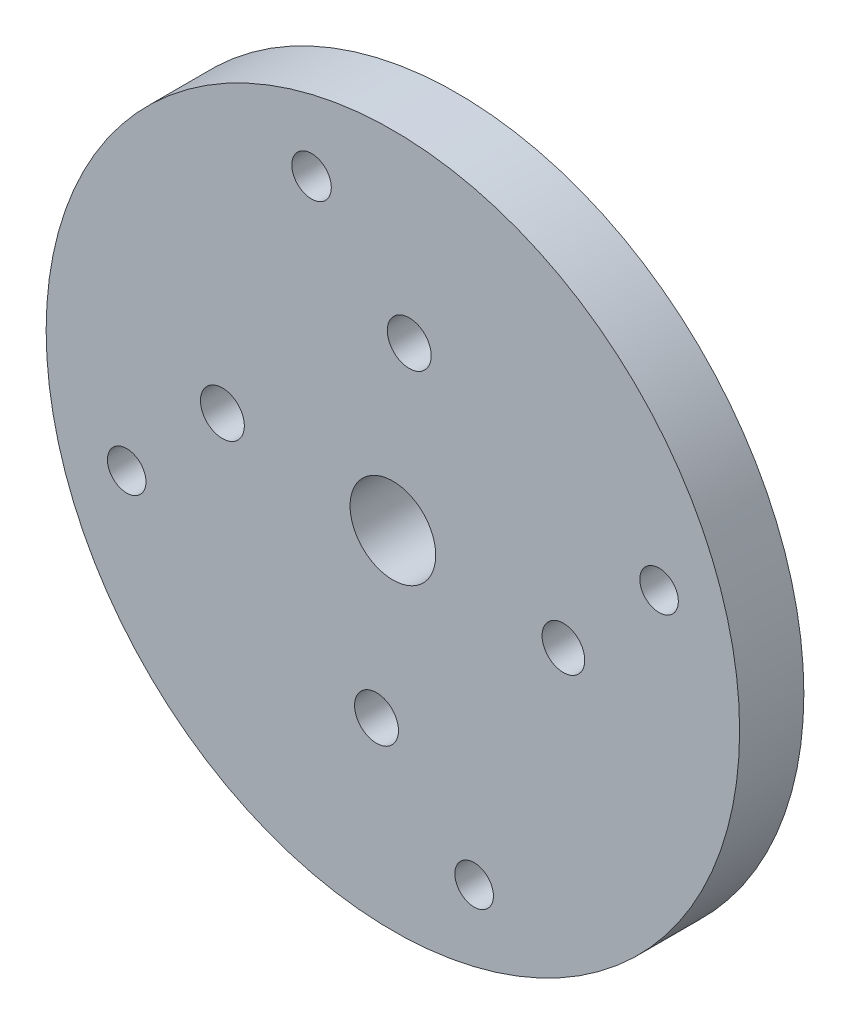
ISO-10303-21;
HEADER;
FILE_DESCRIPTION(('STEP AP214'),'2;1');
FILE_NAME('part.step','',(''),(''),'','','');
FILE_SCHEMA(('AUTOMOTIVE_DESIGN { 1 0 10303 214 1 1 1 1 }'));
ENDSEC;
DATA;
#1=APPLICATION_CONTEXT('core data for automotive mechanical design processes');
#2=APPLICATION_PROTOCOL_DEFINITION('international standard','automotive_design',2000,#1);
#3=PRODUCT_CONTEXT('',#1,'mechanical');
#4=PRODUCT('Part','Part','',(#3));
#5=PRODUCT_RELATED_PRODUCT_CATEGORY('part','',(#4));
#6=PRODUCT_DEFINITION_FORMATION('','',#4);
#7=PRODUCT_DEFINITION_CONTEXT('part definition',#1,'design');
#8=PRODUCT_DEFINITION('design','',#6,#7);
#9=PRODUCT_DEFINITION_SHAPE('','',#8);
#10=(LENGTH_UNIT() NAMED_UNIT(*) SI_UNIT(.MILLI.,.METRE.));
#11=(NAMED_UNIT(*) PLANE_ANGLE_UNIT() SI_UNIT($,.RADIAN.));
#12=(NAMED_UNIT(*) SI_UNIT($,.STERADIAN.) SOLID_ANGLE_UNIT());
#13=UNCERTAINTY_MEASURE_WITH_UNIT(LENGTH_MEASURE(1.E-05),#10,'distance_accuracy_value','');
#14=(GEOMETRIC_REPRESENTATION_CONTEXT(3) GLOBAL_UNCERTAINTY_ASSIGNED_CONTEXT((#13)) GLOBAL_UNIT_ASSIGNED_CONTEXT((#10,
#11,#12)) REPRESENTATION_CONTEXT('',''));
#15=CARTESIAN_POINT('',(0.,0.,0.));
#16=DIRECTION('',(0.,0.,1.));
#17=DIRECTION('',(1.,0.,0.));
#18=AXIS2_PLACEMENT_3D('',#15,#16,#17);
#19=CARTESIAN_POINT('',(0.,0.,3.));
#20=DIRECTION('',(0.,0.,1.));
#21=DIRECTION('',(1.,0.,0.));
#22=AXIS2_PLACEMENT_3D('',#19,#20,#21);
#23=PLANE('',#22);
#24=CARTESIAN_POINT('',(-12.432397674173,-3.79940627877776,3.));
#25=DIRECTION('',(0.,0.,1.));
#26=DIRECTION('',(1.,0.,0.));
#27=AXIS2_PLACEMENT_3D('',#24,#25,#26);
#28=CIRCLE('',#27,0.899999999999998);
#29=CARTESIAN_POINT('',(-11.532397674173,-3.79940627877776,3.));
#30=VERTEX_POINT('',#29);
#31=EDGE_CURVE('E92',#30,#30,#28,.T.);
#32=ORIENTED_EDGE('',*,*,#31,.F.);
#33=EDGE_LOOP('',(#32));
#34=FACE_BOUND('',#33,.T.);
#35=CARTESIAN_POINT('',(3.7952286765895,-12.4336736040638,3.));
#36=DIRECTION('',(0.,0.,1.));
#37=DIRECTION('',(1.,0.,0.));
#38=AXIS2_PLACEMENT_3D('',#35,#36,#37);
#39=CIRCLE('',#38,0.899999999999999);
#40=CARTESIAN_POINT('',(4.6952286765895,-12.4336736040638,3.));
#41=VERTEX_POINT('',#40);
#42=EDGE_CURVE('E86',#41,#41,#39,.T.);
#43=ORIENTED_EDGE('',*,*,#42,.F.);
#44=EDGE_LOOP('',(#43));
#45=FACE_BOUND('',#44,.T.);
#46=CARTESIAN_POINT('',(12.4323976741731,3.79940627877781,3.));
#47=DIRECTION('',(0.,0.,1.));
#48=DIRECTION('',(1.,0.,0.));
#49=AXIS2_PLACEMENT_3D('',#46,#47,#48);
#50=CIRCLE('',#49,0.9);
#51=CARTESIAN_POINT('',(13.3323976741731,3.79940627877781,3.));
#52=VERTEX_POINT('',#51);
#53=EDGE_CURVE('E80',#52,#52,#50,.T.);
#54=ORIENTED_EDGE('',*,*,#53,.F.);
#55=EDGE_LOOP('',(#54));
#56=FACE_BOUND('',#55,.T.);
#57=CARTESIAN_POINT('',(-3.79940627877772,12.4323976741731,3.));
#58=DIRECTION('',(0.,0.,1.));
#59=DIRECTION('',(1.,0.,0.));
#60=AXIS2_PLACEMENT_3D('',#57,#58,#59);
#61=CIRCLE('',#60,0.922873217244393);
#62=CARTESIAN_POINT('',(-2.87653306153333,12.4323976741731,3.));
#63=VERTEX_POINT('',#62);
#64=EDGE_CURVE('E74',#63,#63,#61,.T.);
#65=ORIENTED_EDGE('',*,*,#64,.F.);
#66=EDGE_LOOP('',(#65));
#67=FACE_BOUND('',#66,.T.);
#68=CARTESIAN_POINT('',(-0.764662688049769,-7.963371834437,3.));
#69=DIRECTION('',(0.,0.,1.));
#70=DIRECTION('',(1.,0.,0.));
#71=AXIS2_PLACEMENT_3D('',#68,#69,#70);
#72=CIRCLE('',#71,1.0250000000001);
#73=CARTESIAN_POINT('',(0.260337311950333,-7.963371834437,3.));
#74=VERTEX_POINT('',#73);
#75=EDGE_CURVE('E68',#74,#74,#72,.T.);
#76=ORIENTED_EDGE('',*,*,#75,.F.);
#77=EDGE_LOOP('',(#76));
#78=FACE_BOUND('',#77,.T.);
#79=CARTESIAN_POINT('',(-7.96337183443698,0.764662688049787,3.));
#80=DIRECTION('',(0.,0.,1.));
#81=DIRECTION('',(1.,0.,0.));
#82=AXIS2_PLACEMENT_3D('',#79,#80,#81);
#83=CIRCLE('',#82,1.0250000000001);
#84=CARTESIAN_POINT('',(-6.93837183443688,0.764662688049787,3.));
#85=VERTEX_POINT('',#84);
#86=EDGE_CURVE('E62',#85,#85,#83,.T.);
#87=ORIENTED_EDGE('',*,*,#86,.F.);
#88=EDGE_LOOP('',(#87));
#89=FACE_BOUND('',#88,.T.);
#90=CARTESIAN_POINT('',(0.764662688049797,7.963371834437,3.));
#91=DIRECTION('',(0.,0.,1.));
#92=DIRECTION('',(1.,0.,0.));
#93=AXIS2_PLACEMENT_3D('',#90,#91,#92);
#94=CIRCLE('',#93,1.0250000000001);
#95=CARTESIAN_POINT('',(1.7896626880499,7.963371834437,3.));
#96=VERTEX_POINT('',#95);
#97=EDGE_CURVE('E56',#96,#96,#94,.T.);
#98=ORIENTED_EDGE('',*,*,#97,.F.);
#99=EDGE_LOOP('',(#98));
#100=FACE_BOUND('',#99,.T.);
#101=CARTESIAN_POINT('',(7.96337183443701,-0.76466268804978,3.));
#102=DIRECTION('',(0.,0.,1.));
#103=DIRECTION('',(1.,0.,0.));
#104=AXIS2_PLACEMENT_3D('',#101,#102,#103);
#105=CIRCLE('',#104,0.997616065397464);
#106=CARTESIAN_POINT('',(8.96098789983448,-0.76466268804978,3.));
#107=VERTEX_POINT('',#106);
#108=EDGE_CURVE('E50',#107,#107,#105,.T.);
#109=ORIENTED_EDGE('',*,*,#108,.F.);
#110=EDGE_LOOP('',(#109));
#111=FACE_BOUND('',#110,.T.);
#112=CARTESIAN_POINT('',(0.,0.,3.));
#113=DIRECTION('',(0.,0.,1.));
#114=DIRECTION('',(1.,0.,0.));
#115=AXIS2_PLACEMENT_3D('',#112,#113,#114);
#116=CIRCLE('',#115,16.1955905314912);
#117=CARTESIAN_POINT('',(16.1955905314912,0.,3.));
#118=VERTEX_POINT('',#117);
#119=EDGE_CURVE('E10',#118,#118,#116,.T.);
#120=ORIENTED_EDGE('',*,*,#119,.T.);
#121=EDGE_LOOP('',(#120));
#122=FACE_BOUND('',#121,.T.);
#123=CARTESIAN_POINT('',(0.,0.,3.));
#124=DIRECTION('',(0.,0.,1.));
#125=DIRECTION('',(1.,0.,0.));
#126=AXIS2_PLACEMENT_3D('',#123,#124,#125);
#127=CIRCLE('',#126,2.);
#128=CARTESIAN_POINT('',(2.,0.,3.));
#129=VERTEX_POINT('',#128);
#130=EDGE_CURVE('E42',#129,#129,#127,.T.);
#131=ORIENTED_EDGE('',*,*,#130,.F.);
#132=EDGE_LOOP('',(#131));
#133=FACE_BOUND('',#132,.T.);
#134=ADVANCED_FACE('F31',(#34,#45,#56,#67,#78,#89,#100,#111,#122,#133),#23,.T.);
#135=CARTESIAN_POINT('',(0.,0.,0.));
#136=DIRECTION('',(0.,0.,1.));
#137=DIRECTION('',(1.,0.,0.));
#138=AXIS2_PLACEMENT_3D('',#135,#136,#137);
#139=PLANE('',#138);
#140=CARTESIAN_POINT('',(-12.432397674173,-3.79940627877776,0.));
#141=DIRECTION('',(0.,0.,1.));
#142=DIRECTION('',(1.,0.,0.));
#143=AXIS2_PLACEMENT_3D('',#140,#141,#142);
#144=CIRCLE('',#143,0.899999999999998);
#145=CARTESIAN_POINT('',(-11.532397674173,-3.79940627877776,0.));
#146=VERTEX_POINT('',#145);
#147=EDGE_CURVE('E89',#146,#146,#144,.T.);
#148=ORIENTED_EDGE('',*,*,#147,.T.);
#149=EDGE_LOOP('',(#148));
#150=FACE_BOUND('',#149,.T.);
#151=CARTESIAN_POINT('',(3.7952286765895,-12.4336736040638,0.));
#152=DIRECTION('',(0.,0.,1.));
#153=DIRECTION('',(1.,0.,0.));
#154=AXIS2_PLACEMENT_3D('',#151,#152,#153);
#155=CIRCLE('',#154,0.899999999999999);
#156=CARTESIAN_POINT('',(4.6952286765895,-12.4336736040638,0.));
#157=VERTEX_POINT('',#156);
#158=EDGE_CURVE('E83',#157,#157,#155,.T.);
#159=ORIENTED_EDGE('',*,*,#158,.T.);
#160=EDGE_LOOP('',(#159));
#161=FACE_BOUND('',#160,.T.);
#162=CARTESIAN_POINT('',(12.4323976741731,3.79940627877781,0.));
#163=DIRECTION('',(0.,0.,1.));
#164=DIRECTION('',(1.,0.,0.));
#165=AXIS2_PLACEMENT_3D('',#162,#163,#164);
#166=CIRCLE('',#165,0.9);
#167=CARTESIAN_POINT('',(13.3323976741731,3.79940627877781,0.));
#168=VERTEX_POINT('',#167);
#169=EDGE_CURVE('E77',#168,#168,#166,.T.);
#170=ORIENTED_EDGE('',*,*,#169,.T.);
#171=EDGE_LOOP('',(#170));
#172=FACE_BOUND('',#171,.T.);
#173=CARTESIAN_POINT('',(-3.79940627877772,12.4323976741731,0.));
#174=DIRECTION('',(0.,0.,1.));
#175=DIRECTION('',(1.,0.,0.));
#176=AXIS2_PLACEMENT_3D('',#173,#174,#175);
#177=CIRCLE('',#176,0.922873217244393);
#178=CARTESIAN_POINT('',(-2.87653306153333,12.4323976741731,0.));
#179=VERTEX_POINT('',#178);
#180=EDGE_CURVE('E71',#179,#179,#177,.T.);
#181=ORIENTED_EDGE('',*,*,#180,.T.);
#182=EDGE_LOOP('',(#181));
#183=FACE_BOUND('',#182,.T.);
#184=CARTESIAN_POINT('',(-0.764662688049769,-7.963371834437,0.));
#185=DIRECTION('',(0.,0.,1.));
#186=DIRECTION('',(1.,0.,0.));
#187=AXIS2_PLACEMENT_3D('',#184,#185,#186);
#188=CIRCLE('',#187,1.0250000000001);
#189=CARTESIAN_POINT('',(0.260337311950333,-7.963371834437,0.));
#190=VERTEX_POINT('',#189);
#191=EDGE_CURVE('E65',#190,#190,#188,.T.);
#192=ORIENTED_EDGE('',*,*,#191,.T.);
#193=EDGE_LOOP('',(#192));
#194=FACE_BOUND('',#193,.T.);
#195=CARTESIAN_POINT('',(-7.96337183443698,0.764662688049787,0.));
#196=DIRECTION('',(0.,0.,1.));
#197=DIRECTION('',(1.,0.,0.));
#198=AXIS2_PLACEMENT_3D('',#195,#196,#197);
#199=CIRCLE('',#198,1.0250000000001);
#200=CARTESIAN_POINT('',(-6.93837183443688,0.764662688049787,0.));
#201=VERTEX_POINT('',#200);
#202=EDGE_CURVE('E59',#201,#201,#199,.T.);
#203=ORIENTED_EDGE('',*,*,#202,.T.);
#204=EDGE_LOOP('',(#203));
#205=FACE_BOUND('',#204,.T.);
#206=CARTESIAN_POINT('',(0.764662688049797,7.963371834437,0.));
#207=DIRECTION('',(0.,0.,1.));
#208=DIRECTION('',(1.,0.,0.));
#209=AXIS2_PLACEMENT_3D('',#206,#207,#208);
#210=CIRCLE('',#209,1.0250000000001);
#211=CARTESIAN_POINT('',(1.7896626880499,7.963371834437,0.));
#212=VERTEX_POINT('',#211);
#213=EDGE_CURVE('E53',#212,#212,#210,.T.);
#214=ORIENTED_EDGE('',*,*,#213,.T.);
#215=EDGE_LOOP('',(#214));
#216=FACE_BOUND('',#215,.T.);
#217=CARTESIAN_POINT('',(7.96337183443701,-0.76466268804978,0.));
#218=DIRECTION('',(0.,0.,1.));
#219=DIRECTION('',(1.,0.,0.));
#220=AXIS2_PLACEMENT_3D('',#217,#218,#219);
#221=CIRCLE('',#220,0.997616065397464);
#222=CARTESIAN_POINT('',(8.96098789983448,-0.76466268804978,0.));
#223=VERTEX_POINT('',#222);
#224=EDGE_CURVE('E47',#223,#223,#221,.T.);
#225=ORIENTED_EDGE('',*,*,#224,.T.);
#226=EDGE_LOOP('',(#225));
#227=FACE_BOUND('',#226,.T.);
#228=CARTESIAN_POINT('',(0.,0.,0.));
#229=DIRECTION('',(0.,0.,1.));
#230=DIRECTION('',(1.,0.,0.));
#231=AXIS2_PLACEMENT_3D('',#228,#229,#230);
#232=CIRCLE('',#231,16.1955905314912);
#233=CARTESIAN_POINT('',(16.1955905314912,0.,0.));
#234=VERTEX_POINT('',#233);
#235=EDGE_CURVE('E35',#234,#234,#232,.T.);
#236=ORIENTED_EDGE('',*,*,#235,.F.);
#237=EDGE_LOOP('',(#236));
#238=FACE_BOUND('',#237,.T.);
#239=CARTESIAN_POINT('',(0.,0.,0.));
#240=DIRECTION('',(0.,0.,1.));
#241=DIRECTION('',(1.,0.,0.));
#242=AXIS2_PLACEMENT_3D('',#239,#240,#241);
#243=CIRCLE('',#242,2.);
#244=CARTESIAN_POINT('',(2.,0.,0.));
#245=VERTEX_POINT('',#244);
#246=EDGE_CURVE('E44',#245,#245,#243,.T.);
#247=ORIENTED_EDGE('',*,*,#246,.T.);
#248=EDGE_LOOP('',(#247));
#249=FACE_BOUND('',#248,.T.);
#250=ADVANCED_FACE('F98',(#150,#161,#172,#183,#194,#205,#216,#227,#238,#249),#139,.F.);
#251=CARTESIAN_POINT('',(0.,0.,3.));
#252=DIRECTION('',(0.,0.,-1.));
#253=DIRECTION('',(-1.,0.,0.));
#254=AXIS2_PLACEMENT_3D('',#251,#252,#253);
#255=CYLINDRICAL_SURFACE('',#254,16.1955905314912);
#256=ORIENTED_EDGE('',*,*,#119,.F.);
#257=EDGE_LOOP('',(#256));
#258=FACE_BOUND('',#257,.T.);
#259=ORIENTED_EDGE('',*,*,#235,.T.);
#260=EDGE_LOOP('',(#259));
#261=FACE_BOUND('',#260,.T.);
#262=ADVANCED_FACE('F33',(#258,#261),#255,.T.);
#263=CARTESIAN_POINT('',(0.,0.,3.));
#264=DIRECTION('',(0.,0.,-1.));
#265=DIRECTION('',(-1.,0.,0.));
#266=AXIS2_PLACEMENT_3D('',#263,#264,#265);
#267=CYLINDRICAL_SURFACE('',#266,2.);
#268=ORIENTED_EDGE('',*,*,#130,.T.);
#269=EDGE_LOOP('',(#268));
#270=FACE_BOUND('',#269,.T.);
#271=ORIENTED_EDGE('',*,*,#246,.F.);
#272=EDGE_LOOP('',(#271));
#273=FACE_BOUND('',#272,.T.);
#274=ADVANCED_FACE('F127',(#270,#273),#267,.F.);
#275=CARTESIAN_POINT('',(7.96337183443701,-0.76466268804978,0.));
#276=DIRECTION('',(0.,0.,1.));
#277=DIRECTION('',(1.,0.,0.));
#278=AXIS2_PLACEMENT_3D('',#275,#276,#277);
#279=CYLINDRICAL_SURFACE('',#278,0.997616065397464);
#280=ORIENTED_EDGE('',*,*,#224,.F.);
#281=EDGE_LOOP('',(#280));
#282=FACE_BOUND('',#281,.T.);
#283=ORIENTED_EDGE('',*,*,#108,.T.);
#284=EDGE_LOOP('',(#283));
#285=FACE_BOUND('',#284,.T.);
#286=ADVANCED_FACE('F130',(#282,#285),#279,.F.);
#287=CARTESIAN_POINT('',(0.764662688049797,7.963371834437,0.));
#288=DIRECTION('',(0.,0.,1.));
#289=DIRECTION('',(1.,0.,0.));
#290=AXIS2_PLACEMENT_3D('',#287,#288,#289);
#291=CYLINDRICAL_SURFACE('',#290,1.0250000000001);
#292=ORIENTED_EDGE('',*,*,#213,.F.);
#293=EDGE_LOOP('',(#292));
#294=FACE_BOUND('',#293,.T.);
#295=ORIENTED_EDGE('',*,*,#97,.T.);
#296=EDGE_LOOP('',(#295));
#297=FACE_BOUND('',#296,.T.);
#298=ADVANCED_FACE('F142',(#294,#297),#291,.F.);
#299=CARTESIAN_POINT('',(-7.96337183443698,0.764662688049787,0.));
#300=DIRECTION('',(0.,0.,1.));
#301=DIRECTION('',(1.,0.,0.));
#302=AXIS2_PLACEMENT_3D('',#299,#300,#301);
#303=CYLINDRICAL_SURFACE('',#302,1.0250000000001);
#304=ORIENTED_EDGE('',*,*,#202,.F.);
#305=EDGE_LOOP('',(#304));
#306=FACE_BOUND('',#305,.T.);
#307=ORIENTED_EDGE('',*,*,#86,.T.);
#308=EDGE_LOOP('',(#307));
#309=FACE_BOUND('',#308,.T.);
#310=ADVANCED_FACE('F146',(#306,#309),#303,.F.);
#311=CARTESIAN_POINT('',(-0.764662688049769,-7.963371834437,0.));
#312=DIRECTION('',(0.,0.,1.));
#313=DIRECTION('',(1.,0.,0.));
#314=AXIS2_PLACEMENT_3D('',#311,#312,#313);
#315=CYLINDRICAL_SURFACE('',#314,1.0250000000001);
#316=ORIENTED_EDGE('',*,*,#191,.F.);
#317=EDGE_LOOP('',(#316));
#318=FACE_BOUND('',#317,.T.);
#319=ORIENTED_EDGE('',*,*,#75,.T.);
#320=EDGE_LOOP('',(#319));
#321=FACE_BOUND('',#320,.T.);
#322=ADVANCED_FACE('F150',(#318,#321),#315,.F.);
#323=CARTESIAN_POINT('',(-3.79940627877772,12.4323976741731,0.));
#324=DIRECTION('',(0.,0.,1.));
#325=DIRECTION('',(1.,0.,0.));
#326=AXIS2_PLACEMENT_3D('',#323,#324,#325);
#327=CYLINDRICAL_SURFACE('',#326,0.922873217244393);
#328=ORIENTED_EDGE('',*,*,#180,.F.);
#329=EDGE_LOOP('',(#328));
#330=FACE_BOUND('',#329,.T.);
#331=ORIENTED_EDGE('',*,*,#64,.T.);
#332=EDGE_LOOP('',(#331));
#333=FACE_BOUND('',#332,.T.);
#334=ADVANCED_FACE('F154',(#330,#333),#327,.F.);
#335=CARTESIAN_POINT('',(12.4323976741731,3.79940627877781,0.));
#336=DIRECTION('',(0.,0.,1.));
#337=DIRECTION('',(1.,0.,0.));
#338=AXIS2_PLACEMENT_3D('',#335,#336,#337);
#339=CYLINDRICAL_SURFACE('',#338,0.9);
#340=ORIENTED_EDGE('',*,*,#169,.F.);
#341=EDGE_LOOP('',(#340));
#342=FACE_BOUND('',#341,.T.);
#343=ORIENTED_EDGE('',*,*,#53,.T.);
#344=EDGE_LOOP('',(#343));
#345=FACE_BOUND('',#344,.T.);
#346=ADVANCED_FACE('F158',(#342,#345),#339,.F.);
#347=CARTESIAN_POINT('',(3.7952286765895,-12.4336736040638,0.));
#348=DIRECTION('',(0.,0.,1.));
#349=DIRECTION('',(1.,0.,0.));
#350=AXIS2_PLACEMENT_3D('',#347,#348,#349);
#351=CYLINDRICAL_SURFACE('',#350,0.899999999999999);
#352=ORIENTED_EDGE('',*,*,#158,.F.);
#353=EDGE_LOOP('',(#352));
#354=FACE_BOUND('',#353,.T.);
#355=ORIENTED_EDGE('',*,*,#42,.T.);
#356=EDGE_LOOP('',(#355));
#357=FACE_BOUND('',#356,.T.);
#358=ADVANCED_FACE('F104',(#354,#357),#351,.F.);
#359=CARTESIAN_POINT('',(-12.432397674173,-3.79940627877776,0.));
#360=DIRECTION('',(0.,0.,1.));
#361=DIRECTION('',(1.,0.,0.));
#362=AXIS2_PLACEMENT_3D('',#359,#360,#361);
#363=CYLINDRICAL_SURFACE('',#362,0.899999999999998);
#364=ORIENTED_EDGE('',*,*,#147,.F.);
#365=EDGE_LOOP('',(#364));
#366=FACE_BOUND('',#365,.T.);
#367=ORIENTED_EDGE('',*,*,#31,.T.);
#368=EDGE_LOOP('',(#367));
#369=FACE_BOUND('',#368,.T.);
#370=ADVANCED_FACE('F101',(#366,#369),#363,.F.);
#371=CLOSED_SHELL('',(#134,#250,#262,#274,#286,#298,#310,#322,#334,#346,#358,#370));
#372=MANIFOLD_SOLID_BREP('B2',#371);
#373=ADVANCED_BREP_SHAPE_REPRESENTATION('',(#18,#372),#14);
#374=SHAPE_DEFINITION_REPRESENTATION(#9,#373);
ENDSEC;
END-ISO-10303-21;
